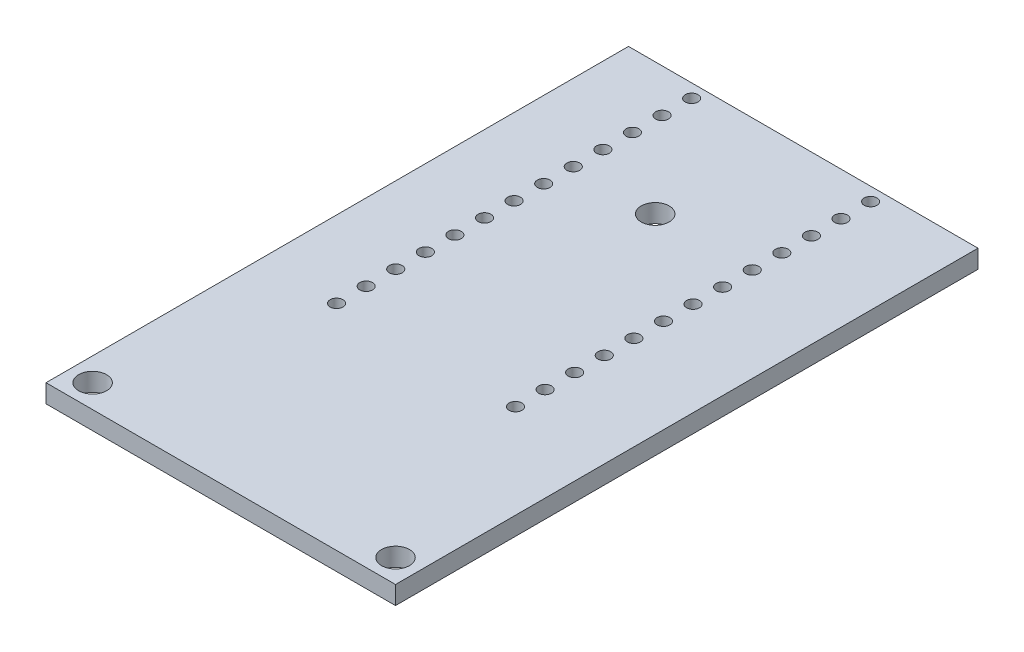
ISO-10303-21;
HEADER;
FILE_DESCRIPTION(('STEP AP214'),'2;1');
FILE_NAME('part.step','',(''),(''),'','','');
FILE_SCHEMA(('AUTOMOTIVE_DESIGN { 1 0 10303 214 1 1 1 1 }'));
ENDSEC;
DATA;
#1=APPLICATION_CONTEXT('core data for automotive mechanical design processes');
#2=APPLICATION_PROTOCOL_DEFINITION('international standard','automotive_design',2000,#1);
#3=PRODUCT_CONTEXT('',#1,'mechanical');
#4=PRODUCT('Part','Part','',(#3));
#5=PRODUCT_RELATED_PRODUCT_CATEGORY('part','',(#4));
#6=PRODUCT_DEFINITION_FORMATION('','',#4);
#7=PRODUCT_DEFINITION_CONTEXT('part definition',#1,'design');
#8=PRODUCT_DEFINITION('design','',#6,#7);
#9=PRODUCT_DEFINITION_SHAPE('','',#8);
#10=(LENGTH_UNIT() NAMED_UNIT(*) SI_UNIT(.MILLI.,.METRE.));
#11=(NAMED_UNIT(*) PLANE_ANGLE_UNIT() SI_UNIT($,.RADIAN.));
#12=(NAMED_UNIT(*) SI_UNIT($,.STERADIAN.) SOLID_ANGLE_UNIT());
#13=UNCERTAINTY_MEASURE_WITH_UNIT(LENGTH_MEASURE(1.E-05),#10,'distance_accuracy_value','');
#14=(GEOMETRIC_REPRESENTATION_CONTEXT(3) GLOBAL_UNCERTAINTY_ASSIGNED_CONTEXT((#13)) GLOBAL_UNIT_ASSIGNED_CONTEXT((#10,
#11,#12)) REPRESENTATION_CONTEXT('',''));
#15=CARTESIAN_POINT('',(0.,0.,0.));
#16=DIRECTION('',(0.,0.,1.));
#17=DIRECTION('',(1.,0.,0.));
#18=AXIS2_PLACEMENT_3D('',#15,#16,#17);
#19=CARTESIAN_POINT('',(15.,1.57,35.));
#20=DIRECTION('',(-1.,0.,0.));
#21=DIRECTION('',(0.,0.,1.));
#22=AXIS2_PLACEMENT_3D('',#19,#20,#21);
#23=PLANE('',#22);
#24=DIRECTION('',(0.,0.,-1.));
#25=VECTOR('',#24,1.);
#26=CARTESIAN_POINT('',(15.,0.,35.));
#27=LINE('',#26,#25);
#28=CARTESIAN_POINT('',(15.,0.,35.));
#29=VERTEX_POINT('',#28);
#30=CARTESIAN_POINT('',(15.,0.,-15.));
#31=VERTEX_POINT('',#30);
#32=EDGE_CURVE('E84',#29,#31,#27,.T.);
#33=ORIENTED_EDGE('',*,*,#32,.T.);
#34=DIRECTION('',(0.,-1.,0.));
#35=VECTOR('',#34,1.);
#36=CARTESIAN_POINT('',(15.,1.57,-15.));
#37=LINE('',#36,#35);
#38=CARTESIAN_POINT('',(15.,1.57,-15.));
#39=VERTEX_POINT('',#38);
#40=EDGE_CURVE('E47',#39,#31,#37,.T.);
#41=ORIENTED_EDGE('',*,*,#40,.F.);
#42=DIRECTION('',(0.,0.,-1.));
#43=VECTOR('',#42,1.);
#44=CARTESIAN_POINT('',(15.,1.57,35.));
#45=LINE('',#44,#43);
#46=CARTESIAN_POINT('',(15.,1.57,35.));
#47=VERTEX_POINT('',#46);
#48=EDGE_CURVE('E79',#47,#39,#45,.T.);
#49=ORIENTED_EDGE('',*,*,#48,.F.);
#50=DIRECTION('',(0.,-1.,0.));
#51=VECTOR('',#50,1.);
#52=CARTESIAN_POINT('',(15.,1.57,35.));
#53=LINE('',#52,#51);
#54=EDGE_CURVE('E72',#47,#29,#53,.T.);
#55=ORIENTED_EDGE('',*,*,#54,.T.);
#56=EDGE_LOOP('',(#33,#41,#49,#55));
#57=FACE_BOUND('',#56,.T.);
#58=ADVANCED_FACE('F32',(#57),#23,.F.);
#59=CARTESIAN_POINT('',(-15.,1.57,35.));
#60=DIRECTION('',(1.,0.,0.));
#61=DIRECTION('',(0.,0.,-1.));
#62=AXIS2_PLACEMENT_3D('',#59,#60,#61);
#63=PLANE('',#62);
#64=DIRECTION('',(0.,0.,1.));
#65=VECTOR('',#64,1.);
#66=CARTESIAN_POINT('',(-15.,1.57,35.));
#67=LINE('',#66,#65);
#68=CARTESIAN_POINT('',(-15.,1.57,-15.));
#69=VERTEX_POINT('',#68);
#70=CARTESIAN_POINT('',(-15.,1.57,35.));
#71=VERTEX_POINT('',#70);
#72=EDGE_CURVE('E616',#69,#71,#67,.T.);
#73=ORIENTED_EDGE('',*,*,#72,.F.);
#74=DIRECTION('',(0.,-1.,0.));
#75=VECTOR('',#74,1.);
#76=CARTESIAN_POINT('',(-15.,1.57,-15.));
#77=LINE('',#76,#75);
#78=CARTESIAN_POINT('',(-15.,0.,-15.));
#79=VERTEX_POINT('',#78);
#80=EDGE_CURVE('E612',#69,#79,#77,.T.);
#81=ORIENTED_EDGE('',*,*,#80,.T.);
#82=DIRECTION('',(0.,0.,1.));
#83=VECTOR('',#82,1.);
#84=CARTESIAN_POINT('',(-15.,0.,35.));
#85=LINE('',#84,#83);
#86=CARTESIAN_POINT('',(-15.,0.,35.));
#87=VERTEX_POINT('',#86);
#88=EDGE_CURVE('E80',#79,#87,#85,.T.);
#89=ORIENTED_EDGE('',*,*,#88,.T.);
#90=DIRECTION('',(0.,-1.,0.));
#91=VECTOR('',#90,1.);
#92=CARTESIAN_POINT('',(-15.,1.57,35.));
#93=LINE('',#92,#91);
#94=EDGE_CURVE('E75',#71,#87,#93,.T.);
#95=ORIENTED_EDGE('',*,*,#94,.F.);
#96=EDGE_LOOP('',(#73,#81,#89,#95));
#97=FACE_BOUND('',#96,.T.);
#98=ADVANCED_FACE('F269',(#97),#63,.F.);
#99=CARTESIAN_POINT('',(-15.,1.57,35.));
#100=DIRECTION('',(0.,0.,-1.));
#101=DIRECTION('',(-1.,0.,0.));
#102=AXIS2_PLACEMENT_3D('',#99,#100,#101);
#103=PLANE('',#102);
#104=DIRECTION('',(1.,0.,0.));
#105=VECTOR('',#104,1.);
#106=CARTESIAN_POINT('',(-15.,0.,35.));
#107=LINE('',#106,#105);
#108=EDGE_CURVE('E69',#87,#29,#107,.T.);
#109=ORIENTED_EDGE('',*,*,#108,.T.);
#110=ORIENTED_EDGE('',*,*,#54,.F.);
#111=DIRECTION('',(1.,0.,0.));
#112=VECTOR('',#111,1.);
#113=CARTESIAN_POINT('',(-15.,1.57,35.));
#114=LINE('',#113,#112);
#115=EDGE_CURVE('E56',#71,#47,#114,.T.);
#116=ORIENTED_EDGE('',*,*,#115,.F.);
#117=ORIENTED_EDGE('',*,*,#94,.T.);
#118=EDGE_LOOP('',(#109,#110,#116,#117));
#119=FACE_BOUND('',#118,.T.);
#120=ADVANCED_FACE('F71',(#119),#103,.F.);
#121=CARTESIAN_POINT('',(0.,1.57,0.));
#122=DIRECTION('',(0.,-1.,0.));
#123=DIRECTION('',(0.,0.,-1.));
#124=AXIS2_PLACEMENT_3D('',#121,#122,#123);
#125=PLANE('',#124);
#126=CARTESIAN_POINT('',(-1.4,1.57,-3.68999999999999));
#127=DIRECTION('',(0.,-1.,0.));
#128=DIRECTION('',(0.,0.,-1.));
#129=AXIS2_PLACEMENT_3D('',#126,#127,#128);
#130=CIRCLE('',#129,1.19999999999999);
#131=CARTESIAN_POINT('',(-1.4,1.57,-4.88999999999999));
#132=VERTEX_POINT('',#131);
#133=EDGE_CURVE('E630',#132,#132,#130,.T.);
#134=ORIENTED_EDGE('',*,*,#133,.T.);
#135=EDGE_LOOP('',(#134));
#136=FACE_BOUND('',#135,.T.);
#137=CARTESIAN_POINT('',(-13.,1.57,33.));
#138=DIRECTION('',(0.,1.,0.));
#139=DIRECTION('',(0.,0.,1.));
#140=AXIS2_PLACEMENT_3D('',#137,#138,#139);
#141=CIRCLE('',#140,1.19999999999999);
#142=CARTESIAN_POINT('',(-13.,1.57,34.2));
#143=VERTEX_POINT('',#142);
#144=EDGE_CURVE('E605',#143,#143,#141,.T.);
#145=ORIENTED_EDGE('',*,*,#144,.F.);
#146=EDGE_LOOP('',(#145));
#147=FACE_BOUND('',#146,.T.);
#148=CARTESIAN_POINT('',(13.,1.57,33.));
#149=DIRECTION('',(0.,1.,0.));
#150=DIRECTION('',(0.,0.,1.));
#151=AXIS2_PLACEMENT_3D('',#148,#149,#150);
#152=CIRCLE('',#151,1.19999999999999);
#153=CARTESIAN_POINT('',(13.,1.57,34.2));
#154=VERTEX_POINT('',#153);
#155=EDGE_CURVE('E93',#154,#154,#152,.T.);
#156=ORIENTED_EDGE('',*,*,#155,.F.);
#157=EDGE_LOOP('',(#156));
#158=FACE_BOUND('',#157,.T.);
#159=ORIENTED_EDGE('',*,*,#48,.T.);
#160=DIRECTION('',(-1.,0.,0.));
#161=VECTOR('',#160,1.);
#162=CARTESIAN_POINT('',(-15.,1.57,-15.));
#163=LINE('',#162,#161);
#164=EDGE_CURVE('E620',#39,#69,#163,.T.);
#165=ORIENTED_EDGE('',*,*,#164,.T.);
#166=ORIENTED_EDGE('',*,*,#72,.T.);
#167=ORIENTED_EDGE('',*,*,#115,.T.);
#168=EDGE_LOOP('',(#159,#165,#166,#167));
#169=FACE_BOUND('',#168,.T.);
#170=CARTESIAN_POINT('',(-8.42999999999999,1.57,-13.85));
#171=DIRECTION('',(0.,1.,0.));
#172=DIRECTION('',(0.,0.,1.));
#173=AXIS2_PLACEMENT_3D('',#170,#171,#172);
#174=CIRCLE('',#173,0.549999999999999);
#175=CARTESIAN_POINT('',(-8.42999999999999,1.57,-13.3));
#176=VERTEX_POINT('',#175);
#177=EDGE_CURVE('E102',#176,#176,#174,.T.);
#178=ORIENTED_EDGE('',*,*,#177,.F.);
#179=EDGE_LOOP('',(#178));
#180=FACE_BOUND('',#179,.T.);
#181=CARTESIAN_POINT('',(-8.42999999999999,1.57,-11.31));
#182=DIRECTION('',(0.,1.,0.));
#183=DIRECTION('',(0.,0.,1.));
#184=AXIS2_PLACEMENT_3D('',#181,#182,#183);
#185=CIRCLE('',#184,0.549999999999999);
#186=CARTESIAN_POINT('',(-8.42999999999999,1.57,-10.76));
#187=VERTEX_POINT('',#186);
#188=EDGE_CURVE('E108',#187,#187,#185,.T.);
#189=ORIENTED_EDGE('',*,*,#188,.F.);
#190=EDGE_LOOP('',(#189));
#191=FACE_BOUND('',#190,.T.);
#192=CARTESIAN_POINT('',(-8.42999999999999,1.57,-8.77));
#193=DIRECTION('',(0.,1.,0.));
#194=DIRECTION('',(0.,0.,1.));
#195=AXIS2_PLACEMENT_3D('',#192,#193,#194);
#196=CIRCLE('',#195,0.549999999999999);
#197=CARTESIAN_POINT('',(-8.42999999999999,1.57,-8.22000000000001));
#198=VERTEX_POINT('',#197);
#199=EDGE_CURVE('E114',#198,#198,#196,.T.);
#200=ORIENTED_EDGE('',*,*,#199,.F.);
#201=EDGE_LOOP('',(#200));
#202=FACE_BOUND('',#201,.T.);
#203=CARTESIAN_POINT('',(-8.42999999999999,1.57,-6.23));
#204=DIRECTION('',(0.,1.,0.));
#205=DIRECTION('',(0.,0.,1.));
#206=AXIS2_PLACEMENT_3D('',#203,#204,#205);
#207=CIRCLE('',#206,0.549999999999999);
#208=CARTESIAN_POINT('',(-8.42999999999999,1.57,-5.68000000000001));
#209=VERTEX_POINT('',#208);
#210=EDGE_CURVE('E120',#209,#209,#207,.T.);
#211=ORIENTED_EDGE('',*,*,#210,.F.);
#212=EDGE_LOOP('',(#211));
#213=FACE_BOUND('',#212,.T.);
#214=CARTESIAN_POINT('',(-8.42999999999999,1.57,-3.69000000000001));
#215=DIRECTION('',(0.,1.,0.));
#216=DIRECTION('',(0.,0.,1.));
#217=AXIS2_PLACEMENT_3D('',#214,#215,#216);
#218=CIRCLE('',#217,0.549999999999999);
#219=CARTESIAN_POINT('',(-8.42999999999999,1.57,-3.14000000000001));
#220=VERTEX_POINT('',#219);
#221=EDGE_CURVE('E126',#220,#220,#218,.T.);
#222=ORIENTED_EDGE('',*,*,#221,.F.);
#223=EDGE_LOOP('',(#222));
#224=FACE_BOUND('',#223,.T.);
#225=CARTESIAN_POINT('',(-8.42999999999999,1.57,-1.15000000000001));
#226=DIRECTION('',(0.,1.,0.));
#227=DIRECTION('',(0.,0.,1.));
#228=AXIS2_PLACEMENT_3D('',#225,#226,#227);
#229=CIRCLE('',#228,0.549999999999999);
#230=CARTESIAN_POINT('',(-8.42999999999999,1.57,-0.600000000000006));
#231=VERTEX_POINT('',#230);
#232=EDGE_CURVE('E132',#231,#231,#229,.T.);
#233=ORIENTED_EDGE('',*,*,#232,.F.);
#234=EDGE_LOOP('',(#233));
#235=FACE_BOUND('',#234,.T.);
#236=CARTESIAN_POINT('',(-8.42999999999999,1.57,1.39));
#237=DIRECTION('',(0.,1.,0.));
#238=DIRECTION('',(0.,0.,1.));
#239=AXIS2_PLACEMENT_3D('',#236,#237,#238);
#240=CIRCLE('',#239,0.549999999999999);
#241=CARTESIAN_POINT('',(-8.42999999999999,1.57,1.93999999999999));
#242=VERTEX_POINT('',#241);
#243=EDGE_CURVE('E138',#242,#242,#240,.T.);
#244=ORIENTED_EDGE('',*,*,#243,.F.);
#245=EDGE_LOOP('',(#244));
#246=FACE_BOUND('',#245,.T.);
#247=CARTESIAN_POINT('',(-8.42999999999999,1.57,3.93));
#248=DIRECTION('',(0.,1.,0.));
#249=DIRECTION('',(0.,0.,1.));
#250=AXIS2_PLACEMENT_3D('',#247,#248,#249);
#251=CIRCLE('',#250,0.549999999999999);
#252=CARTESIAN_POINT('',(-8.42999999999999,1.57,4.48));
#253=VERTEX_POINT('',#252);
#254=EDGE_CURVE('E144',#253,#253,#251,.T.);
#255=ORIENTED_EDGE('',*,*,#254,.F.);
#256=EDGE_LOOP('',(#255));
#257=FACE_BOUND('',#256,.T.);
#258=CARTESIAN_POINT('',(-8.42999999999999,1.57,6.47));
#259=DIRECTION('',(0.,1.,0.));
#260=DIRECTION('',(0.,0.,1.));
#261=AXIS2_PLACEMENT_3D('',#258,#259,#260);
#262=CIRCLE('',#261,0.549999999999999);
#263=CARTESIAN_POINT('',(-8.42999999999999,1.57,7.02));
#264=VERTEX_POINT('',#263);
#265=EDGE_CURVE('E150',#264,#264,#262,.T.);
#266=ORIENTED_EDGE('',*,*,#265,.F.);
#267=EDGE_LOOP('',(#266));
#268=FACE_BOUND('',#267,.T.);
#269=CARTESIAN_POINT('',(-8.42999999999999,1.57,9.01));
#270=DIRECTION('',(0.,1.,0.));
#271=DIRECTION('',(0.,0.,1.));
#272=AXIS2_PLACEMENT_3D('',#269,#270,#271);
#273=CIRCLE('',#272,0.549999999999999);
#274=CARTESIAN_POINT('',(-8.42999999999999,1.57,9.56));
#275=VERTEX_POINT('',#274);
#276=EDGE_CURVE('E156',#275,#275,#273,.T.);
#277=ORIENTED_EDGE('',*,*,#276,.F.);
#278=EDGE_LOOP('',(#277));
#279=FACE_BOUND('',#278,.T.);
#280=CARTESIAN_POINT('',(-8.42999999999999,1.57,11.55));
#281=DIRECTION('',(0.,1.,0.));
#282=DIRECTION('',(0.,0.,1.));
#283=AXIS2_PLACEMENT_3D('',#280,#281,#282);
#284=CIRCLE('',#283,0.549999999999999);
#285=CARTESIAN_POINT('',(-8.42999999999999,1.57,12.1));
#286=VERTEX_POINT('',#285);
#287=EDGE_CURVE('E162',#286,#286,#284,.T.);
#288=ORIENTED_EDGE('',*,*,#287,.F.);
#289=EDGE_LOOP('',(#288));
#290=FACE_BOUND('',#289,.T.);
#291=CARTESIAN_POINT('',(-8.42999999999999,1.57,14.09));
#292=DIRECTION('',(0.,1.,0.));
#293=DIRECTION('',(0.,0.,1.));
#294=AXIS2_PLACEMENT_3D('',#291,#292,#293);
#295=CIRCLE('',#294,0.549999999999999);
#296=CARTESIAN_POINT('',(-8.42999999999999,1.57,14.64));
#297=VERTEX_POINT('',#296);
#298=EDGE_CURVE('E168',#297,#297,#295,.T.);
#299=ORIENTED_EDGE('',*,*,#298,.F.);
#300=EDGE_LOOP('',(#299));
#301=FACE_BOUND('',#300,.T.);
#302=CARTESIAN_POINT('',(-8.42999999999999,1.57,16.63));
#303=DIRECTION('',(0.,1.,0.));
#304=DIRECTION('',(0.,0.,1.));
#305=AXIS2_PLACEMENT_3D('',#302,#303,#304);
#306=CIRCLE('',#305,0.549999999999999);
#307=CARTESIAN_POINT('',(-8.42999999999999,1.57,17.18));
#308=VERTEX_POINT('',#307);
#309=EDGE_CURVE('E174',#308,#308,#306,.T.);
#310=ORIENTED_EDGE('',*,*,#309,.F.);
#311=EDGE_LOOP('',(#310));
#312=FACE_BOUND('',#311,.T.);
#313=CARTESIAN_POINT('',(6.93,1.57,-13.85));
#314=DIRECTION('',(0.,1.,0.));
#315=DIRECTION('',(0.,0.,1.));
#316=AXIS2_PLACEMENT_3D('',#313,#314,#315);
#317=CIRCLE('',#316,0.55);
#318=CARTESIAN_POINT('',(6.93,1.57,-13.3));
#319=VERTEX_POINT('',#318);
#320=EDGE_CURVE('E180',#319,#319,#317,.T.);
#321=ORIENTED_EDGE('',*,*,#320,.F.);
#322=EDGE_LOOP('',(#321));
#323=FACE_BOUND('',#322,.T.);
#324=CARTESIAN_POINT('',(6.93,1.57,-11.31));
#325=DIRECTION('',(0.,1.,0.));
#326=DIRECTION('',(0.,0.,1.));
#327=AXIS2_PLACEMENT_3D('',#324,#325,#326);
#328=CIRCLE('',#327,0.55);
#329=CARTESIAN_POINT('',(6.93,1.57,-10.76));
#330=VERTEX_POINT('',#329);
#331=EDGE_CURVE('E186',#330,#330,#328,.T.);
#332=ORIENTED_EDGE('',*,*,#331,.F.);
#333=EDGE_LOOP('',(#332));
#334=FACE_BOUND('',#333,.T.);
#335=CARTESIAN_POINT('',(6.93,1.57,-8.77000000000001));
#336=DIRECTION('',(0.,1.,0.));
#337=DIRECTION('',(0.,0.,1.));
#338=AXIS2_PLACEMENT_3D('',#335,#336,#337);
#339=CIRCLE('',#338,0.55);
#340=CARTESIAN_POINT('',(6.93,1.57,-8.22000000000001));
#341=VERTEX_POINT('',#340);
#342=EDGE_CURVE('E192',#341,#341,#339,.T.);
#343=ORIENTED_EDGE('',*,*,#342,.F.);
#344=EDGE_LOOP('',(#343));
#345=FACE_BOUND('',#344,.T.);
#346=CARTESIAN_POINT('',(6.93,1.57,-6.23000000000001));
#347=DIRECTION('',(0.,1.,0.));
#348=DIRECTION('',(0.,0.,1.));
#349=AXIS2_PLACEMENT_3D('',#346,#347,#348);
#350=CIRCLE('',#349,0.55);
#351=CARTESIAN_POINT('',(6.93,1.57,-5.68000000000001));
#352=VERTEX_POINT('',#351);
#353=EDGE_CURVE('E198',#352,#352,#350,.T.);
#354=ORIENTED_EDGE('',*,*,#353,.F.);
#355=EDGE_LOOP('',(#354));
#356=FACE_BOUND('',#355,.T.);
#357=CARTESIAN_POINT('',(6.93,1.57,-3.69000000000001));
#358=DIRECTION('',(0.,1.,0.));
#359=DIRECTION('',(0.,0.,1.));
#360=AXIS2_PLACEMENT_3D('',#357,#358,#359);
#361=CIRCLE('',#360,0.55);
#362=CARTESIAN_POINT('',(6.93,1.57,-3.14000000000001));
#363=VERTEX_POINT('',#362);
#364=EDGE_CURVE('E204',#363,#363,#361,.T.);
#365=ORIENTED_EDGE('',*,*,#364,.F.);
#366=EDGE_LOOP('',(#365));
#367=FACE_BOUND('',#366,.T.);
#368=CARTESIAN_POINT('',(6.93,1.57,-1.15000000000001));
#369=DIRECTION('',(0.,1.,0.));
#370=DIRECTION('',(0.,0.,1.));
#371=AXIS2_PLACEMENT_3D('',#368,#369,#370);
#372=CIRCLE('',#371,0.55);
#373=CARTESIAN_POINT('',(6.93,1.57,-0.600000000000009));
#374=VERTEX_POINT('',#373);
#375=EDGE_CURVE('E210',#374,#374,#372,.T.);
#376=ORIENTED_EDGE('',*,*,#375,.F.);
#377=EDGE_LOOP('',(#376));
#378=FACE_BOUND('',#377,.T.);
#379=CARTESIAN_POINT('',(6.93,1.57,1.38999999999999));
#380=DIRECTION('',(0.,1.,0.));
#381=DIRECTION('',(0.,0.,1.));
#382=AXIS2_PLACEMENT_3D('',#379,#380,#381);
#383=CIRCLE('',#382,0.55);
#384=CARTESIAN_POINT('',(6.93,1.57,1.93999999999999));
#385=VERTEX_POINT('',#384);
#386=EDGE_CURVE('E216',#385,#385,#383,.T.);
#387=ORIENTED_EDGE('',*,*,#386,.F.);
#388=EDGE_LOOP('',(#387));
#389=FACE_BOUND('',#388,.T.);
#390=CARTESIAN_POINT('',(6.93,1.57,3.92999999999999));
#391=DIRECTION('',(0.,1.,0.));
#392=DIRECTION('',(0.,0.,1.));
#393=AXIS2_PLACEMENT_3D('',#390,#391,#392);
#394=CIRCLE('',#393,0.55);
#395=CARTESIAN_POINT('',(6.93,1.57,4.47999999999999));
#396=VERTEX_POINT('',#395);
#397=EDGE_CURVE('E222',#396,#396,#394,.T.);
#398=ORIENTED_EDGE('',*,*,#397,.F.);
#399=EDGE_LOOP('',(#398));
#400=FACE_BOUND('',#399,.T.);
#401=CARTESIAN_POINT('',(6.93,1.57,6.46999999999999));
#402=DIRECTION('',(0.,1.,0.));
#403=DIRECTION('',(0.,0.,1.));
#404=AXIS2_PLACEMENT_3D('',#401,#402,#403);
#405=CIRCLE('',#404,0.55);
#406=CARTESIAN_POINT('',(6.93,1.57,7.01999999999999));
#407=VERTEX_POINT('',#406);
#408=EDGE_CURVE('E228',#407,#407,#405,.T.);
#409=ORIENTED_EDGE('',*,*,#408,.F.);
#410=EDGE_LOOP('',(#409));
#411=FACE_BOUND('',#410,.T.);
#412=CARTESIAN_POINT('',(6.93,1.57,9.00999999999999));
#413=DIRECTION('',(0.,1.,0.));
#414=DIRECTION('',(0.,0.,1.));
#415=AXIS2_PLACEMENT_3D('',#412,#413,#414);
#416=CIRCLE('',#415,0.55);
#417=CARTESIAN_POINT('',(6.93,1.57,9.55999999999999));
#418=VERTEX_POINT('',#417);
#419=EDGE_CURVE('E234',#418,#418,#416,.T.);
#420=ORIENTED_EDGE('',*,*,#419,.F.);
#421=EDGE_LOOP('',(#420));
#422=FACE_BOUND('',#421,.T.);
#423=CARTESIAN_POINT('',(6.93,1.57,11.55));
#424=DIRECTION('',(0.,1.,0.));
#425=DIRECTION('',(0.,0.,1.));
#426=AXIS2_PLACEMENT_3D('',#423,#424,#425);
#427=CIRCLE('',#426,0.55);
#428=CARTESIAN_POINT('',(6.93,1.57,12.1));
#429=VERTEX_POINT('',#428);
#430=EDGE_CURVE('E240',#429,#429,#427,.T.);
#431=ORIENTED_EDGE('',*,*,#430,.F.);
#432=EDGE_LOOP('',(#431));
#433=FACE_BOUND('',#432,.T.);
#434=CARTESIAN_POINT('',(6.93,1.57,14.09));
#435=DIRECTION('',(0.,1.,0.));
#436=DIRECTION('',(0.,0.,1.));
#437=AXIS2_PLACEMENT_3D('',#434,#435,#436);
#438=CIRCLE('',#437,0.55);
#439=CARTESIAN_POINT('',(6.93,1.57,14.64));
#440=VERTEX_POINT('',#439);
#441=EDGE_CURVE('E246',#440,#440,#438,.T.);
#442=ORIENTED_EDGE('',*,*,#441,.F.);
#443=EDGE_LOOP('',(#442));
#444=FACE_BOUND('',#443,.T.);
#445=CARTESIAN_POINT('',(6.93,1.57,16.63));
#446=DIRECTION('',(0.,1.,0.));
#447=DIRECTION('',(0.,0.,1.));
#448=AXIS2_PLACEMENT_3D('',#445,#446,#447);
#449=CIRCLE('',#448,0.55);
#450=CARTESIAN_POINT('',(6.93,1.57,17.18));
#451=VERTEX_POINT('',#450);
#452=EDGE_CURVE('E11',#451,#451,#449,.T.);
#453=ORIENTED_EDGE('',*,*,#452,.F.);
#454=EDGE_LOOP('',(#453));
#455=FACE_BOUND('',#454,.T.);
#456=ADVANCED_FACE('F258',(#136,#147,#158,#169,#180,#191,#202,#213,#224,#235,#246,#257,#268,
#279,#290,#301,#312,#323,#334,#345,#356,#367,#378,#389,#400,#411,#422,#433,#444,#455),#125,.F.);
#457=CARTESIAN_POINT('',(0.,0.,0.));
#458=DIRECTION('',(0.,-1.,0.));
#459=DIRECTION('',(0.,0.,-1.));
#460=AXIS2_PLACEMENT_3D('',#457,#458,#459);
#461=PLANE('',#460);
#462=CARTESIAN_POINT('',(-1.4,0.,-3.68999999999999));
#463=DIRECTION('',(0.,-1.,0.));
#464=DIRECTION('',(0.,0.,-1.));
#465=AXIS2_PLACEMENT_3D('',#462,#463,#464);
#466=CIRCLE('',#465,1.19999999999999);
#467=CARTESIAN_POINT('',(-1.4,0.,-4.88999999999998));
#468=VERTEX_POINT('',#467);
#469=EDGE_CURVE('E633',#468,#468,#466,.T.);
#470=ORIENTED_EDGE('',*,*,#469,.F.);
#471=EDGE_LOOP('',(#470));
#472=FACE_BOUND('',#471,.T.);
#473=DIRECTION('',(-1.,0.,0.));
#474=VECTOR('',#473,1.);
#475=CARTESIAN_POINT('',(-15.,0.,-15.));
#476=LINE('',#475,#474);
#477=EDGE_CURVE('E88',#31,#79,#476,.T.);
#478=ORIENTED_EDGE('',*,*,#477,.F.);
#479=ORIENTED_EDGE('',*,*,#32,.F.);
#480=ORIENTED_EDGE('',*,*,#108,.F.);
#481=ORIENTED_EDGE('',*,*,#88,.F.);
#482=EDGE_LOOP('',(#478,#479,#480,#481));
#483=FACE_BOUND('',#482,.T.);
#484=CARTESIAN_POINT('',(-13.,0.,33.));
#485=DIRECTION('',(0.,-1.,0.));
#486=DIRECTION('',(0.,0.,-1.));
#487=AXIS2_PLACEMENT_3D('',#484,#485,#486);
#488=CIRCLE('',#487,1.19999999999999);
#489=CARTESIAN_POINT('',(-13.,0.,31.8));
#490=VERTEX_POINT('',#489);
#491=EDGE_CURVE('E608',#490,#490,#488,.T.);
#492=ORIENTED_EDGE('',*,*,#491,.F.);
#493=EDGE_LOOP('',(#492));
#494=FACE_BOUND('',#493,.T.);
#495=CARTESIAN_POINT('',(13.,0.,33.));
#496=DIRECTION('',(0.,-1.,0.));
#497=DIRECTION('',(0.,0.,-1.));
#498=AXIS2_PLACEMENT_3D('',#495,#496,#497);
#499=CIRCLE('',#498,1.19999999999999);
#500=CARTESIAN_POINT('',(13.,0.,31.8));
#501=VERTEX_POINT('',#500);
#502=EDGE_CURVE('E89',#501,#501,#499,.T.);
#503=ORIENTED_EDGE('',*,*,#502,.F.);
#504=EDGE_LOOP('',(#503));
#505=FACE_BOUND('',#504,.T.);
#506=CARTESIAN_POINT('',(-8.42999999999999,0.,-13.85));
#507=DIRECTION('',(0.,-1.,0.));
#508=DIRECTION('',(0.,0.,-1.));
#509=AXIS2_PLACEMENT_3D('',#506,#507,#508);
#510=CIRCLE('',#509,0.549999999999999);
#511=CARTESIAN_POINT('',(-8.42999999999999,0.,-14.4));
#512=VERTEX_POINT('',#511);
#513=EDGE_CURVE('E99',#512,#512,#510,.F.);
#514=ORIENTED_EDGE('',*,*,#513,.T.);
#515=EDGE_LOOP('',(#514));
#516=FACE_BOUND('',#515,.T.);
#517=CARTESIAN_POINT('',(-8.42999999999999,0.,-11.31));
#518=DIRECTION('',(0.,-1.,0.));
#519=DIRECTION('',(0.,0.,-1.));
#520=AXIS2_PLACEMENT_3D('',#517,#518,#519);
#521=CIRCLE('',#520,0.549999999999999);
#522=CARTESIAN_POINT('',(-8.42999999999999,0.,-11.86));
#523=VERTEX_POINT('',#522);
#524=EDGE_CURVE('E105',#523,#523,#521,.F.);
#525=ORIENTED_EDGE('',*,*,#524,.T.);
#526=EDGE_LOOP('',(#525));
#527=FACE_BOUND('',#526,.T.);
#528=CARTESIAN_POINT('',(-8.42999999999999,0.,-8.77));
#529=DIRECTION('',(0.,-1.,0.));
#530=DIRECTION('',(0.,0.,-1.));
#531=AXIS2_PLACEMENT_3D('',#528,#529,#530);
#532=CIRCLE('',#531,0.549999999999999);
#533=CARTESIAN_POINT('',(-8.42999999999999,0.,-9.32));
#534=VERTEX_POINT('',#533);
#535=EDGE_CURVE('E111',#534,#534,#532,.F.);
#536=ORIENTED_EDGE('',*,*,#535,.T.);
#537=EDGE_LOOP('',(#536));
#538=FACE_BOUND('',#537,.T.);
#539=CARTESIAN_POINT('',(-8.42999999999999,0.,-6.23));
#540=DIRECTION('',(0.,-1.,0.));
#541=DIRECTION('',(0.,0.,-1.));
#542=AXIS2_PLACEMENT_3D('',#539,#540,#541);
#543=CIRCLE('',#542,0.549999999999999);
#544=CARTESIAN_POINT('',(-8.42999999999999,0.,-6.78));
#545=VERTEX_POINT('',#544);
#546=EDGE_CURVE('E117',#545,#545,#543,.F.);
#547=ORIENTED_EDGE('',*,*,#546,.T.);
#548=EDGE_LOOP('',(#547));
#549=FACE_BOUND('',#548,.T.);
#550=CARTESIAN_POINT('',(-8.42999999999999,0.,-3.69000000000001));
#551=DIRECTION('',(0.,-1.,0.));
#552=DIRECTION('',(0.,0.,-1.));
#553=AXIS2_PLACEMENT_3D('',#550,#551,#552);
#554=CIRCLE('',#553,0.549999999999999);
#555=CARTESIAN_POINT('',(-8.42999999999999,0.,-4.24));
#556=VERTEX_POINT('',#555);
#557=EDGE_CURVE('E123',#556,#556,#554,.F.);
#558=ORIENTED_EDGE('',*,*,#557,.T.);
#559=EDGE_LOOP('',(#558));
#560=FACE_BOUND('',#559,.T.);
#561=CARTESIAN_POINT('',(-8.42999999999999,0.,-1.15000000000001));
#562=DIRECTION('',(0.,-1.,0.));
#563=DIRECTION('',(0.,0.,-1.));
#564=AXIS2_PLACEMENT_3D('',#561,#562,#563);
#565=CIRCLE('',#564,0.549999999999999);
#566=CARTESIAN_POINT('',(-8.42999999999999,0.,-1.7));
#567=VERTEX_POINT('',#566);
#568=EDGE_CURVE('E129',#567,#567,#565,.F.);
#569=ORIENTED_EDGE('',*,*,#568,.T.);
#570=EDGE_LOOP('',(#569));
#571=FACE_BOUND('',#570,.T.);
#572=CARTESIAN_POINT('',(-8.42999999999999,0.,1.39));
#573=DIRECTION('',(0.,-1.,0.));
#574=DIRECTION('',(0.,0.,-1.));
#575=AXIS2_PLACEMENT_3D('',#572,#573,#574);
#576=CIRCLE('',#575,0.549999999999999);
#577=CARTESIAN_POINT('',(-8.42999999999999,0.,0.839999999999996));
#578=VERTEX_POINT('',#577);
#579=EDGE_CURVE('E135',#578,#578,#576,.F.);
#580=ORIENTED_EDGE('',*,*,#579,.T.);
#581=EDGE_LOOP('',(#580));
#582=FACE_BOUND('',#581,.T.);
#583=CARTESIAN_POINT('',(-8.42999999999999,0.,3.93));
#584=DIRECTION('',(0.,-1.,0.));
#585=DIRECTION('',(0.,0.,-1.));
#586=AXIS2_PLACEMENT_3D('',#583,#584,#585);
#587=CIRCLE('',#586,0.549999999999999);
#588=CARTESIAN_POINT('',(-8.42999999999999,0.,3.38));
#589=VERTEX_POINT('',#588);
#590=EDGE_CURVE('E141',#589,#589,#587,.F.);
#591=ORIENTED_EDGE('',*,*,#590,.T.);
#592=EDGE_LOOP('',(#591));
#593=FACE_BOUND('',#592,.T.);
#594=CARTESIAN_POINT('',(-8.42999999999999,0.,6.47));
#595=DIRECTION('',(0.,-1.,0.));
#596=DIRECTION('',(0.,0.,-1.));
#597=AXIS2_PLACEMENT_3D('',#594,#595,#596);
#598=CIRCLE('',#597,0.549999999999999);
#599=CARTESIAN_POINT('',(-8.42999999999999,0.,5.92));
#600=VERTEX_POINT('',#599);
#601=EDGE_CURVE('E147',#600,#600,#598,.F.);
#602=ORIENTED_EDGE('',*,*,#601,.T.);
#603=EDGE_LOOP('',(#602));
#604=FACE_BOUND('',#603,.T.);
#605=CARTESIAN_POINT('',(-8.42999999999999,0.,9.01));
#606=DIRECTION('',(0.,-1.,0.));
#607=DIRECTION('',(0.,0.,-1.));
#608=AXIS2_PLACEMENT_3D('',#605,#606,#607);
#609=CIRCLE('',#608,0.549999999999999);
#610=CARTESIAN_POINT('',(-8.42999999999999,0.,8.46));
#611=VERTEX_POINT('',#610);
#612=EDGE_CURVE('E153',#611,#611,#609,.F.);
#613=ORIENTED_EDGE('',*,*,#612,.T.);
#614=EDGE_LOOP('',(#613));
#615=FACE_BOUND('',#614,.T.);
#616=CARTESIAN_POINT('',(-8.42999999999999,0.,11.55));
#617=DIRECTION('',(0.,-1.,0.));
#618=DIRECTION('',(0.,0.,-1.));
#619=AXIS2_PLACEMENT_3D('',#616,#617,#618);
#620=CIRCLE('',#619,0.549999999999999);
#621=CARTESIAN_POINT('',(-8.42999999999999,0.,11.));
#622=VERTEX_POINT('',#621);
#623=EDGE_CURVE('E159',#622,#622,#620,.F.);
#624=ORIENTED_EDGE('',*,*,#623,.T.);
#625=EDGE_LOOP('',(#624));
#626=FACE_BOUND('',#625,.T.);
#627=CARTESIAN_POINT('',(-8.42999999999999,0.,14.09));
#628=DIRECTION('',(0.,-1.,0.));
#629=DIRECTION('',(0.,0.,-1.));
#630=AXIS2_PLACEMENT_3D('',#627,#628,#629);
#631=CIRCLE('',#630,0.549999999999999);
#632=CARTESIAN_POINT('',(-8.42999999999999,0.,13.54));
#633=VERTEX_POINT('',#632);
#634=EDGE_CURVE('E165',#633,#633,#631,.F.);
#635=ORIENTED_EDGE('',*,*,#634,.T.);
#636=EDGE_LOOP('',(#635));
#637=FACE_BOUND('',#636,.T.);
#638=CARTESIAN_POINT('',(-8.42999999999999,0.,16.63));
#639=DIRECTION('',(0.,-1.,0.));
#640=DIRECTION('',(0.,0.,-1.));
#641=AXIS2_PLACEMENT_3D('',#638,#639,#640);
#642=CIRCLE('',#641,0.549999999999999);
#643=CARTESIAN_POINT('',(-8.42999999999999,0.,16.08));
#644=VERTEX_POINT('',#643);
#645=EDGE_CURVE('E171',#644,#644,#642,.F.);
#646=ORIENTED_EDGE('',*,*,#645,.T.);
#647=EDGE_LOOP('',(#646));
#648=FACE_BOUND('',#647,.T.);
#649=CARTESIAN_POINT('',(6.93,0.,-13.85));
#650=DIRECTION('',(0.,-1.,0.));
#651=DIRECTION('',(0.,0.,-1.));
#652=AXIS2_PLACEMENT_3D('',#649,#650,#651);
#653=CIRCLE('',#652,0.55);
#654=CARTESIAN_POINT('',(6.93,0.,-14.4));
#655=VERTEX_POINT('',#654);
#656=EDGE_CURVE('E177',#655,#655,#653,.F.);
#657=ORIENTED_EDGE('',*,*,#656,.T.);
#658=EDGE_LOOP('',(#657));
#659=FACE_BOUND('',#658,.T.);
#660=CARTESIAN_POINT('',(6.93,0.,-11.31));
#661=DIRECTION('',(0.,-1.,0.));
#662=DIRECTION('',(0.,0.,-1.));
#663=AXIS2_PLACEMENT_3D('',#660,#661,#662);
#664=CIRCLE('',#663,0.55);
#665=CARTESIAN_POINT('',(6.93,0.,-11.86));
#666=VERTEX_POINT('',#665);
#667=EDGE_CURVE('E183',#666,#666,#664,.F.);
#668=ORIENTED_EDGE('',*,*,#667,.T.);
#669=EDGE_LOOP('',(#668));
#670=FACE_BOUND('',#669,.T.);
#671=CARTESIAN_POINT('',(6.93,0.,-8.77000000000001));
#672=DIRECTION('',(0.,-1.,0.));
#673=DIRECTION('',(0.,0.,-1.));
#674=AXIS2_PLACEMENT_3D('',#671,#672,#673);
#675=CIRCLE('',#674,0.55);
#676=CARTESIAN_POINT('',(6.93,0.,-9.32000000000001));
#677=VERTEX_POINT('',#676);
#678=EDGE_CURVE('E189',#677,#677,#675,.F.);
#679=ORIENTED_EDGE('',*,*,#678,.T.);
#680=EDGE_LOOP('',(#679));
#681=FACE_BOUND('',#680,.T.);
#682=CARTESIAN_POINT('',(6.93,0.,-6.23000000000001));
#683=DIRECTION('',(0.,-1.,0.));
#684=DIRECTION('',(0.,0.,-1.));
#685=AXIS2_PLACEMENT_3D('',#682,#683,#684);
#686=CIRCLE('',#685,0.55);
#687=CARTESIAN_POINT('',(6.93,0.,-6.78000000000001));
#688=VERTEX_POINT('',#687);
#689=EDGE_CURVE('E195',#688,#688,#686,.F.);
#690=ORIENTED_EDGE('',*,*,#689,.T.);
#691=EDGE_LOOP('',(#690));
#692=FACE_BOUND('',#691,.T.);
#693=CARTESIAN_POINT('',(6.93,0.,-3.69000000000001));
#694=DIRECTION('',(0.,-1.,0.));
#695=DIRECTION('',(0.,0.,-1.));
#696=AXIS2_PLACEMENT_3D('',#693,#694,#695);
#697=CIRCLE('',#696,0.55);
#698=CARTESIAN_POINT('',(6.93,0.,-4.24000000000001));
#699=VERTEX_POINT('',#698);
#700=EDGE_CURVE('E201',#699,#699,#697,.F.);
#701=ORIENTED_EDGE('',*,*,#700,.T.);
#702=EDGE_LOOP('',(#701));
#703=FACE_BOUND('',#702,.T.);
#704=CARTESIAN_POINT('',(6.93,0.,-1.15000000000001));
#705=DIRECTION('',(0.,-1.,0.));
#706=DIRECTION('',(0.,0.,-1.));
#707=AXIS2_PLACEMENT_3D('',#704,#705,#706);
#708=CIRCLE('',#707,0.55);
#709=CARTESIAN_POINT('',(6.93,0.,-1.70000000000001));
#710=VERTEX_POINT('',#709);
#711=EDGE_CURVE('E207',#710,#710,#708,.F.);
#712=ORIENTED_EDGE('',*,*,#711,.T.);
#713=EDGE_LOOP('',(#712));
#714=FACE_BOUND('',#713,.T.);
#715=CARTESIAN_POINT('',(6.93,0.,1.38999999999999));
#716=DIRECTION('',(0.,-1.,0.));
#717=DIRECTION('',(0.,0.,-1.));
#718=AXIS2_PLACEMENT_3D('',#715,#716,#717);
#719=CIRCLE('',#718,0.55);
#720=CARTESIAN_POINT('',(6.93,0.,0.839999999999992));
#721=VERTEX_POINT('',#720);
#722=EDGE_CURVE('E213',#721,#721,#719,.F.);
#723=ORIENTED_EDGE('',*,*,#722,.T.);
#724=EDGE_LOOP('',(#723));
#725=FACE_BOUND('',#724,.T.);
#726=CARTESIAN_POINT('',(6.93,0.,3.92999999999999));
#727=DIRECTION('',(0.,-1.,0.));
#728=DIRECTION('',(0.,0.,-1.));
#729=AXIS2_PLACEMENT_3D('',#726,#727,#728);
#730=CIRCLE('',#729,0.55);
#731=CARTESIAN_POINT('',(6.93,0.,3.37999999999999));
#732=VERTEX_POINT('',#731);
#733=EDGE_CURVE('E219',#732,#732,#730,.F.);
#734=ORIENTED_EDGE('',*,*,#733,.T.);
#735=EDGE_LOOP('',(#734));
#736=FACE_BOUND('',#735,.T.);
#737=CARTESIAN_POINT('',(6.93,0.,6.46999999999999));
#738=DIRECTION('',(0.,-1.,0.));
#739=DIRECTION('',(0.,0.,-1.));
#740=AXIS2_PLACEMENT_3D('',#737,#738,#739);
#741=CIRCLE('',#740,0.55);
#742=CARTESIAN_POINT('',(6.93,0.,5.91999999999999));
#743=VERTEX_POINT('',#742);
#744=EDGE_CURVE('E225',#743,#743,#741,.F.);
#745=ORIENTED_EDGE('',*,*,#744,.T.);
#746=EDGE_LOOP('',(#745));
#747=FACE_BOUND('',#746,.T.);
#748=CARTESIAN_POINT('',(6.93,0.,9.00999999999999));
#749=DIRECTION('',(0.,-1.,0.));
#750=DIRECTION('',(0.,0.,-1.));
#751=AXIS2_PLACEMENT_3D('',#748,#749,#750);
#752=CIRCLE('',#751,0.55);
#753=CARTESIAN_POINT('',(6.93,0.,8.45999999999999));
#754=VERTEX_POINT('',#753);
#755=EDGE_CURVE('E231',#754,#754,#752,.F.);
#756=ORIENTED_EDGE('',*,*,#755,.T.);
#757=EDGE_LOOP('',(#756));
#758=FACE_BOUND('',#757,.T.);
#759=CARTESIAN_POINT('',(6.93,0.,11.55));
#760=DIRECTION('',(0.,-1.,0.));
#761=DIRECTION('',(0.,0.,-1.));
#762=AXIS2_PLACEMENT_3D('',#759,#760,#761);
#763=CIRCLE('',#762,0.55);
#764=CARTESIAN_POINT('',(6.93,0.,11.));
#765=VERTEX_POINT('',#764);
#766=EDGE_CURVE('E237',#765,#765,#763,.F.);
#767=ORIENTED_EDGE('',*,*,#766,.T.);
#768=EDGE_LOOP('',(#767));
#769=FACE_BOUND('',#768,.T.);
#770=CARTESIAN_POINT('',(6.93,0.,14.09));
#771=DIRECTION('',(0.,-1.,0.));
#772=DIRECTION('',(0.,0.,-1.));
#773=AXIS2_PLACEMENT_3D('',#770,#771,#772);
#774=CIRCLE('',#773,0.55);
#775=CARTESIAN_POINT('',(6.93,0.,13.54));
#776=VERTEX_POINT('',#775);
#777=EDGE_CURVE('E243',#776,#776,#774,.F.);
#778=ORIENTED_EDGE('',*,*,#777,.T.);
#779=EDGE_LOOP('',(#778));
#780=FACE_BOUND('',#779,.T.);
#781=CARTESIAN_POINT('',(6.93,0.,16.63));
#782=DIRECTION('',(0.,-1.,0.));
#783=DIRECTION('',(0.,0.,-1.));
#784=AXIS2_PLACEMENT_3D('',#781,#782,#783);
#785=CIRCLE('',#784,0.55);
#786=CARTESIAN_POINT('',(6.93,0.,16.08));
#787=VERTEX_POINT('',#786);
#788=EDGE_CURVE('E40',#787,#787,#785,.F.);
#789=ORIENTED_EDGE('',*,*,#788,.T.);
#790=EDGE_LOOP('',(#789));
#791=FACE_BOUND('',#790,.T.);
#792=ADVANCED_FACE('F86',(#472,#483,#494,#505,#516,#527,#538,#549,#560,#571,#582,#593,#604,#615,
#626,#637,#648,#659,#670,#681,#692,#703,#714,#725,#736,#747,#758,#769,#780,#791),#461,.T.);
#793=CARTESIAN_POINT('',(13.,1.57,33.));
#794=DIRECTION('',(0.,1.,0.));
#795=DIRECTION('',(0.,0.,1.));
#796=AXIS2_PLACEMENT_3D('',#793,#794,#795);
#797=CYLINDRICAL_SURFACE('',#796,1.19999999999999);
#798=ORIENTED_EDGE('',*,*,#155,.T.);
#799=EDGE_LOOP('',(#798));
#800=FACE_BOUND('',#799,.T.);
#801=ORIENTED_EDGE('',*,*,#502,.T.);
#802=EDGE_LOOP('',(#801));
#803=FACE_BOUND('',#802,.T.);
#804=ADVANCED_FACE('F266',(#800,#803),#797,.F.);
#805=CARTESIAN_POINT('',(-13.,1.57,33.));
#806=DIRECTION('',(0.,1.,0.));
#807=DIRECTION('',(0.,0.,1.));
#808=AXIS2_PLACEMENT_3D('',#805,#806,#807);
#809=CYLINDRICAL_SURFACE('',#808,1.19999999999999);
#810=ORIENTED_EDGE('',*,*,#144,.T.);
#811=EDGE_LOOP('',(#810));
#812=FACE_BOUND('',#811,.T.);
#813=ORIENTED_EDGE('',*,*,#491,.T.);
#814=EDGE_LOOP('',(#813));
#815=FACE_BOUND('',#814,.T.);
#816=ADVANCED_FACE('F286',(#812,#815),#809,.F.);
#817=CARTESIAN_POINT('',(-8.42999999999999,-0.000999999999999916,-13.85));
#818=DIRECTION('',(0.,1.,0.));
#819=DIRECTION('',(0.,0.,1.));
#820=AXIS2_PLACEMENT_3D('',#817,#818,#819);
#821=CYLINDRICAL_SURFACE('',#820,0.549999999999999);
#822=ORIENTED_EDGE('',*,*,#513,.F.);
#823=EDGE_LOOP('',(#822));
#824=FACE_BOUND('',#823,.T.);
#825=ORIENTED_EDGE('',*,*,#177,.T.);
#826=EDGE_LOOP('',(#825));
#827=FACE_BOUND('',#826,.T.);
#828=ADVANCED_FACE('F282',(#824,#827),#821,.F.);
#829=CARTESIAN_POINT('',(-8.42999999999999,-0.000999999999999916,-11.31));
#830=DIRECTION('',(0.,1.,0.));
#831=DIRECTION('',(0.,0.,1.));
#832=AXIS2_PLACEMENT_3D('',#829,#830,#831);
#833=CYLINDRICAL_SURFACE('',#832,0.549999999999999);
#834=ORIENTED_EDGE('',*,*,#524,.F.);
#835=EDGE_LOOP('',(#834));
#836=FACE_BOUND('',#835,.T.);
#837=ORIENTED_EDGE('',*,*,#188,.T.);
#838=EDGE_LOOP('',(#837));
#839=FACE_BOUND('',#838,.T.);
#840=ADVANCED_FACE('F285',(#836,#839),#833,.F.);
#841=CARTESIAN_POINT('',(-8.42999999999999,-0.000999999999999916,-8.77));
#842=DIRECTION('',(0.,1.,0.));
#843=DIRECTION('',(0.,0.,1.));
#844=AXIS2_PLACEMENT_3D('',#841,#842,#843);
#845=CYLINDRICAL_SURFACE('',#844,0.549999999999999);
#846=ORIENTED_EDGE('',*,*,#535,.F.);
#847=EDGE_LOOP('',(#846));
#848=FACE_BOUND('',#847,.T.);
#849=ORIENTED_EDGE('',*,*,#199,.T.);
#850=EDGE_LOOP('',(#849));
#851=FACE_BOUND('',#850,.T.);
#852=ADVANCED_FACE('F290',(#848,#851),#845,.F.);
#853=CARTESIAN_POINT('',(-8.42999999999999,-0.000999999999999916,-6.23));
#854=DIRECTION('',(0.,1.,0.));
#855=DIRECTION('',(0.,0.,1.));
#856=AXIS2_PLACEMENT_3D('',#853,#854,#855);
#857=CYLINDRICAL_SURFACE('',#856,0.549999999999999);
#858=ORIENTED_EDGE('',*,*,#546,.F.);
#859=EDGE_LOOP('',(#858));
#860=FACE_BOUND('',#859,.T.);
#861=ORIENTED_EDGE('',*,*,#210,.T.);
#862=EDGE_LOOP('',(#861));
#863=FACE_BOUND('',#862,.T.);
#864=ADVANCED_FACE('F294',(#860,#863),#857,.F.);
#865=CARTESIAN_POINT('',(-8.42999999999999,-0.000999999999999916,-3.69000000000001));
#866=DIRECTION('',(0.,1.,0.));
#867=DIRECTION('',(0.,0.,1.));
#868=AXIS2_PLACEMENT_3D('',#865,#866,#867);
#869=CYLINDRICAL_SURFACE('',#868,0.549999999999999);
#870=ORIENTED_EDGE('',*,*,#557,.F.);
#871=EDGE_LOOP('',(#870));
#872=FACE_BOUND('',#871,.T.);
#873=ORIENTED_EDGE('',*,*,#221,.T.);
#874=EDGE_LOOP('',(#873));
#875=FACE_BOUND('',#874,.T.);
#876=ADVANCED_FACE('F298',(#872,#875),#869,.F.);
#877=CARTESIAN_POINT('',(-8.42999999999999,-0.000999999999999916,-1.15000000000001));
#878=DIRECTION('',(0.,1.,0.));
#879=DIRECTION('',(0.,0.,1.));
#880=AXIS2_PLACEMENT_3D('',#877,#878,#879);
#881=CYLINDRICAL_SURFACE('',#880,0.549999999999999);
#882=ORIENTED_EDGE('',*,*,#568,.F.);
#883=EDGE_LOOP('',(#882));
#884=FACE_BOUND('',#883,.T.);
#885=ORIENTED_EDGE('',*,*,#232,.T.);
#886=EDGE_LOOP('',(#885));
#887=FACE_BOUND('',#886,.T.);
#888=ADVANCED_FACE('F302',(#884,#887),#881,.F.);
#889=CARTESIAN_POINT('',(-8.42999999999999,-0.000999999999999916,1.39));
#890=DIRECTION('',(0.,1.,0.));
#891=DIRECTION('',(0.,0.,1.));
#892=AXIS2_PLACEMENT_3D('',#889,#890,#891);
#893=CYLINDRICAL_SURFACE('',#892,0.549999999999999);
#894=ORIENTED_EDGE('',*,*,#579,.F.);
#895=EDGE_LOOP('',(#894));
#896=FACE_BOUND('',#895,.T.);
#897=ORIENTED_EDGE('',*,*,#243,.T.);
#898=EDGE_LOOP('',(#897));
#899=FACE_BOUND('',#898,.T.);
#900=ADVANCED_FACE('F306',(#896,#899),#893,.F.);
#901=CARTESIAN_POINT('',(-8.42999999999999,-0.000999999999999916,3.93));
#902=DIRECTION('',(0.,1.,0.));
#903=DIRECTION('',(0.,0.,1.));
#904=AXIS2_PLACEMENT_3D('',#901,#902,#903);
#905=CYLINDRICAL_SURFACE('',#904,0.549999999999999);
#906=ORIENTED_EDGE('',*,*,#590,.F.);
#907=EDGE_LOOP('',(#906));
#908=FACE_BOUND('',#907,.T.);
#909=ORIENTED_EDGE('',*,*,#254,.T.);
#910=EDGE_LOOP('',(#909));
#911=FACE_BOUND('',#910,.T.);
#912=ADVANCED_FACE('F310',(#908,#911),#905,.F.);
#913=CARTESIAN_POINT('',(-8.42999999999999,-0.000999999999999916,6.47));
#914=DIRECTION('',(0.,1.,0.));
#915=DIRECTION('',(0.,0.,1.));
#916=AXIS2_PLACEMENT_3D('',#913,#914,#915);
#917=CYLINDRICAL_SURFACE('',#916,0.549999999999999);
#918=ORIENTED_EDGE('',*,*,#601,.F.);
#919=EDGE_LOOP('',(#918));
#920=FACE_BOUND('',#919,.T.);
#921=ORIENTED_EDGE('',*,*,#265,.T.);
#922=EDGE_LOOP('',(#921));
#923=FACE_BOUND('',#922,.T.);
#924=ADVANCED_FACE('F314',(#920,#923),#917,.F.);
#925=CARTESIAN_POINT('',(-8.42999999999999,-0.000999999999999916,9.01));
#926=DIRECTION('',(0.,1.,0.));
#927=DIRECTION('',(0.,0.,1.));
#928=AXIS2_PLACEMENT_3D('',#925,#926,#927);
#929=CYLINDRICAL_SURFACE('',#928,0.549999999999999);
#930=ORIENTED_EDGE('',*,*,#612,.F.);
#931=EDGE_LOOP('',(#930));
#932=FACE_BOUND('',#931,.T.);
#933=ORIENTED_EDGE('',*,*,#276,.T.);
#934=EDGE_LOOP('',(#933));
#935=FACE_BOUND('',#934,.T.);
#936=ADVANCED_FACE('F318',(#932,#935),#929,.F.);
#937=CARTESIAN_POINT('',(-8.42999999999999,-0.000999999999999916,11.55));
#938=DIRECTION('',(0.,1.,0.));
#939=DIRECTION('',(0.,0.,1.));
#940=AXIS2_PLACEMENT_3D('',#937,#938,#939);
#941=CYLINDRICAL_SURFACE('',#940,0.549999999999999);
#942=ORIENTED_EDGE('',*,*,#623,.F.);
#943=EDGE_LOOP('',(#942));
#944=FACE_BOUND('',#943,.T.);
#945=ORIENTED_EDGE('',*,*,#287,.T.);
#946=EDGE_LOOP('',(#945));
#947=FACE_BOUND('',#946,.T.);
#948=ADVANCED_FACE('F322',(#944,#947),#941,.F.);
#949=CARTESIAN_POINT('',(-8.42999999999999,-0.000999999999999916,14.09));
#950=DIRECTION('',(0.,1.,0.));
#951=DIRECTION('',(0.,0.,1.));
#952=AXIS2_PLACEMENT_3D('',#949,#950,#951);
#953=CYLINDRICAL_SURFACE('',#952,0.549999999999999);
#954=ORIENTED_EDGE('',*,*,#634,.F.);
#955=EDGE_LOOP('',(#954));
#956=FACE_BOUND('',#955,.T.);
#957=ORIENTED_EDGE('',*,*,#298,.T.);
#958=EDGE_LOOP('',(#957));
#959=FACE_BOUND('',#958,.T.);
#960=ADVANCED_FACE('F326',(#956,#959),#953,.F.);
#961=CARTESIAN_POINT('',(-8.42999999999999,-0.000999999999999916,16.63));
#962=DIRECTION('',(0.,1.,0.));
#963=DIRECTION('',(0.,0.,1.));
#964=AXIS2_PLACEMENT_3D('',#961,#962,#963);
#965=CYLINDRICAL_SURFACE('',#964,0.549999999999999);
#966=ORIENTED_EDGE('',*,*,#645,.F.);
#967=EDGE_LOOP('',(#966));
#968=FACE_BOUND('',#967,.T.);
#969=ORIENTED_EDGE('',*,*,#309,.T.);
#970=EDGE_LOOP('',(#969));
#971=FACE_BOUND('',#970,.T.);
#972=ADVANCED_FACE('F330',(#968,#971),#965,.F.);
#973=CARTESIAN_POINT('',(6.93,-0.000999999999999916,-13.85));
#974=DIRECTION('',(0.,1.,0.));
#975=DIRECTION('',(0.,0.,1.));
#976=AXIS2_PLACEMENT_3D('',#973,#974,#975);
#977=CYLINDRICAL_SURFACE('',#976,0.55);
#978=ORIENTED_EDGE('',*,*,#656,.F.);
#979=EDGE_LOOP('',(#978));
#980=FACE_BOUND('',#979,.T.);
#981=ORIENTED_EDGE('',*,*,#320,.T.);
#982=EDGE_LOOP('',(#981));
#983=FACE_BOUND('',#982,.T.);
#984=ADVANCED_FACE('F334',(#980,#983),#977,.F.);
#985=CARTESIAN_POINT('',(6.93,-0.000999999999999916,-11.31));
#986=DIRECTION('',(0.,1.,0.));
#987=DIRECTION('',(0.,0.,1.));
#988=AXIS2_PLACEMENT_3D('',#985,#986,#987);
#989=CYLINDRICAL_SURFACE('',#988,0.55);
#990=ORIENTED_EDGE('',*,*,#667,.F.);
#991=EDGE_LOOP('',(#990));
#992=FACE_BOUND('',#991,.T.);
#993=ORIENTED_EDGE('',*,*,#331,.T.);
#994=EDGE_LOOP('',(#993));
#995=FACE_BOUND('',#994,.T.);
#996=ADVANCED_FACE('F338',(#992,#995),#989,.F.);
#997=CARTESIAN_POINT('',(6.93,-0.000999999999999916,-8.77000000000001));
#998=DIRECTION('',(0.,1.,0.));
#999=DIRECTION('',(0.,0.,1.));
#1000=AXIS2_PLACEMENT_3D('',#997,#998,#999);
#1001=CYLINDRICAL_SURFACE('',#1000,0.55);
#1002=ORIENTED_EDGE('',*,*,#678,.F.);
#1003=EDGE_LOOP('',(#1002));
#1004=FACE_BOUND('',#1003,.T.);
#1005=ORIENTED_EDGE('',*,*,#342,.T.);
#1006=EDGE_LOOP('',(#1005));
#1007=FACE_BOUND('',#1006,.T.);
#1008=ADVANCED_FACE('F342',(#1004,#1007),#1001,.F.);
#1009=CARTESIAN_POINT('',(6.93,-0.000999999999999916,-6.23000000000001));
#1010=DIRECTION('',(0.,1.,0.));
#1011=DIRECTION('',(0.,0.,1.));
#1012=AXIS2_PLACEMENT_3D('',#1009,#1010,#1011);
#1013=CYLINDRICAL_SURFACE('',#1012,0.55);
#1014=ORIENTED_EDGE('',*,*,#689,.F.);
#1015=EDGE_LOOP('',(#1014));
#1016=FACE_BOUND('',#1015,.T.);
#1017=ORIENTED_EDGE('',*,*,#353,.T.);
#1018=EDGE_LOOP('',(#1017));
#1019=FACE_BOUND('',#1018,.T.);
#1020=ADVANCED_FACE('F346',(#1016,#1019),#1013,.F.);
#1021=CARTESIAN_POINT('',(6.93,-0.000999999999999916,-3.69000000000001));
#1022=DIRECTION('',(0.,1.,0.));
#1023=DIRECTION('',(0.,0.,1.));
#1024=AXIS2_PLACEMENT_3D('',#1021,#1022,#1023);
#1025=CYLINDRICAL_SURFACE('',#1024,0.55);
#1026=ORIENTED_EDGE('',*,*,#700,.F.);
#1027=EDGE_LOOP('',(#1026));
#1028=FACE_BOUND('',#1027,.T.);
#1029=ORIENTED_EDGE('',*,*,#364,.T.);
#1030=EDGE_LOOP('',(#1029));
#1031=FACE_BOUND('',#1030,.T.);
#1032=ADVANCED_FACE('F350',(#1028,#1031),#1025,.F.);
#1033=CARTESIAN_POINT('',(6.93,-0.000999999999999916,-1.15000000000001));
#1034=DIRECTION('',(0.,1.,0.));
#1035=DIRECTION('',(0.,0.,1.));
#1036=AXIS2_PLACEMENT_3D('',#1033,#1034,#1035);
#1037=CYLINDRICAL_SURFACE('',#1036,0.55);
#1038=ORIENTED_EDGE('',*,*,#711,.F.);
#1039=EDGE_LOOP('',(#1038));
#1040=FACE_BOUND('',#1039,.T.);
#1041=ORIENTED_EDGE('',*,*,#375,.T.);
#1042=EDGE_LOOP('',(#1041));
#1043=FACE_BOUND('',#1042,.T.);
#1044=ADVANCED_FACE('F354',(#1040,#1043),#1037,.F.);
#1045=CARTESIAN_POINT('',(6.93,-0.000999999999999916,1.38999999999999));
#1046=DIRECTION('',(0.,1.,0.));
#1047=DIRECTION('',(0.,0.,1.));
#1048=AXIS2_PLACEMENT_3D('',#1045,#1046,#1047);
#1049=CYLINDRICAL_SURFACE('',#1048,0.55);
#1050=ORIENTED_EDGE('',*,*,#722,.F.);
#1051=EDGE_LOOP('',(#1050));
#1052=FACE_BOUND('',#1051,.T.);
#1053=ORIENTED_EDGE('',*,*,#386,.T.);
#1054=EDGE_LOOP('',(#1053));
#1055=FACE_BOUND('',#1054,.T.);
#1056=ADVANCED_FACE('F358',(#1052,#1055),#1049,.F.);
#1057=CARTESIAN_POINT('',(6.93,-0.000999999999999916,3.92999999999999));
#1058=DIRECTION('',(0.,1.,0.));
#1059=DIRECTION('',(0.,0.,1.));
#1060=AXIS2_PLACEMENT_3D('',#1057,#1058,#1059);
#1061=CYLINDRICAL_SURFACE('',#1060,0.55);
#1062=ORIENTED_EDGE('',*,*,#733,.F.);
#1063=EDGE_LOOP('',(#1062));
#1064=FACE_BOUND('',#1063,.T.);
#1065=ORIENTED_EDGE('',*,*,#397,.T.);
#1066=EDGE_LOOP('',(#1065));
#1067=FACE_BOUND('',#1066,.T.);
#1068=ADVANCED_FACE('F362',(#1064,#1067),#1061,.F.);
#1069=CARTESIAN_POINT('',(6.93,-0.000999999999999916,6.46999999999999));
#1070=DIRECTION('',(0.,1.,0.));
#1071=DIRECTION('',(0.,0.,1.));
#1072=AXIS2_PLACEMENT_3D('',#1069,#1070,#1071);
#1073=CYLINDRICAL_SURFACE('',#1072,0.55);
#1074=ORIENTED_EDGE('',*,*,#744,.F.);
#1075=EDGE_LOOP('',(#1074));
#1076=FACE_BOUND('',#1075,.T.);
#1077=ORIENTED_EDGE('',*,*,#408,.T.);
#1078=EDGE_LOOP('',(#1077));
#1079=FACE_BOUND('',#1078,.T.);
#1080=ADVANCED_FACE('F366',(#1076,#1079),#1073,.F.);
#1081=CARTESIAN_POINT('',(6.93,-0.000999999999999916,9.00999999999999));
#1082=DIRECTION('',(0.,1.,0.));
#1083=DIRECTION('',(0.,0.,1.));
#1084=AXIS2_PLACEMENT_3D('',#1081,#1082,#1083);
#1085=CYLINDRICAL_SURFACE('',#1084,0.55);
#1086=ORIENTED_EDGE('',*,*,#755,.F.);
#1087=EDGE_LOOP('',(#1086));
#1088=FACE_BOUND('',#1087,.T.);
#1089=ORIENTED_EDGE('',*,*,#419,.T.);
#1090=EDGE_LOOP('',(#1089));
#1091=FACE_BOUND('',#1090,.T.);
#1092=ADVANCED_FACE('F370',(#1088,#1091),#1085,.F.);
#1093=CARTESIAN_POINT('',(6.93,-0.000999999999999916,11.55));
#1094=DIRECTION('',(0.,1.,0.));
#1095=DIRECTION('',(0.,0.,1.));
#1096=AXIS2_PLACEMENT_3D('',#1093,#1094,#1095);
#1097=CYLINDRICAL_SURFACE('',#1096,0.55);
#1098=ORIENTED_EDGE('',*,*,#766,.F.);
#1099=EDGE_LOOP('',(#1098));
#1100=FACE_BOUND('',#1099,.T.);
#1101=ORIENTED_EDGE('',*,*,#430,.T.);
#1102=EDGE_LOOP('',(#1101));
#1103=FACE_BOUND('',#1102,.T.);
#1104=ADVANCED_FACE('F374',(#1100,#1103),#1097,.F.);
#1105=CARTESIAN_POINT('',(6.93,-0.000999999999999916,14.09));
#1106=DIRECTION('',(0.,1.,0.));
#1107=DIRECTION('',(0.,0.,1.));
#1108=AXIS2_PLACEMENT_3D('',#1105,#1106,#1107);
#1109=CYLINDRICAL_SURFACE('',#1108,0.55);
#1110=ORIENTED_EDGE('',*,*,#777,.F.);
#1111=EDGE_LOOP('',(#1110));
#1112=FACE_BOUND('',#1111,.T.);
#1113=ORIENTED_EDGE('',*,*,#441,.T.);
#1114=EDGE_LOOP('',(#1113));
#1115=FACE_BOUND('',#1114,.T.);
#1116=ADVANCED_FACE('F255',(#1112,#1115),#1109,.F.);
#1117=CARTESIAN_POINT('',(6.93,-0.000999999999999916,16.63));
#1118=DIRECTION('',(0.,1.,0.));
#1119=DIRECTION('',(0.,0.,1.));
#1120=AXIS2_PLACEMENT_3D('',#1117,#1118,#1119);
#1121=CYLINDRICAL_SURFACE('',#1120,0.55);
#1122=ORIENTED_EDGE('',*,*,#788,.F.);
#1123=EDGE_LOOP('',(#1122));
#1124=FACE_BOUND('',#1123,.T.);
#1125=ORIENTED_EDGE('',*,*,#452,.T.);
#1126=EDGE_LOOP('',(#1125));
#1127=FACE_BOUND('',#1126,.T.);
#1128=ADVANCED_FACE('F34',(#1124,#1127),#1121,.F.);
#1129=CARTESIAN_POINT('',(-15.,1.57,-15.));
#1130=DIRECTION('',(0.,0.,1.));
#1131=DIRECTION('',(1.,0.,0.));
#1132=AXIS2_PLACEMENT_3D('',#1129,#1130,#1131);
#1133=PLANE('',#1132);
#1134=ORIENTED_EDGE('',*,*,#477,.T.);
#1135=ORIENTED_EDGE('',*,*,#80,.F.);
#1136=ORIENTED_EDGE('',*,*,#164,.F.);
#1137=ORIENTED_EDGE('',*,*,#40,.T.);
#1138=EDGE_LOOP('',(#1134,#1135,#1136,#1137));
#1139=FACE_BOUND('',#1138,.T.);
#1140=ADVANCED_FACE('F254',(#1139),#1133,.F.);
#1141=CARTESIAN_POINT('',(-1.4,0.,-3.68999999999999));
#1142=DIRECTION('',(0.,-1.,0.));
#1143=DIRECTION('',(0.,0.,-1.));
#1144=AXIS2_PLACEMENT_3D('',#1141,#1142,#1143);
#1145=CYLINDRICAL_SURFACE('',#1144,1.19999999999999);
#1146=ORIENTED_EDGE('',*,*,#133,.F.);
#1147=EDGE_LOOP('',(#1146));
#1148=FACE_BOUND('',#1147,.T.);
#1149=ORIENTED_EDGE('',*,*,#469,.T.);
#1150=EDGE_LOOP('',(#1149));
#1151=FACE_BOUND('',#1150,.T.);
#1152=ADVANCED_FACE('F399',(#1148,#1151),#1145,.F.);
#1153=CLOSED_SHELL('',(#58,#98,#120,#456,#792,#804,#816,#828,#840,#852,#864,#876,#888,#900,#912,
#924,#936,#948,#960,#972,#984,#996,#1008,#1020,#1032,#1044,#1056,#1068,#1080,#1092,#1104,#1116,
#1128,#1140,#1152));
#1154=MANIFOLD_SOLID_BREP('B2',#1153);
#1155=ADVANCED_BREP_SHAPE_REPRESENTATION('',(#18,#1154),#14);
#1156=SHAPE_DEFINITION_REPRESENTATION(#9,#1155);
ENDSEC;
END-ISO-10303-21;
